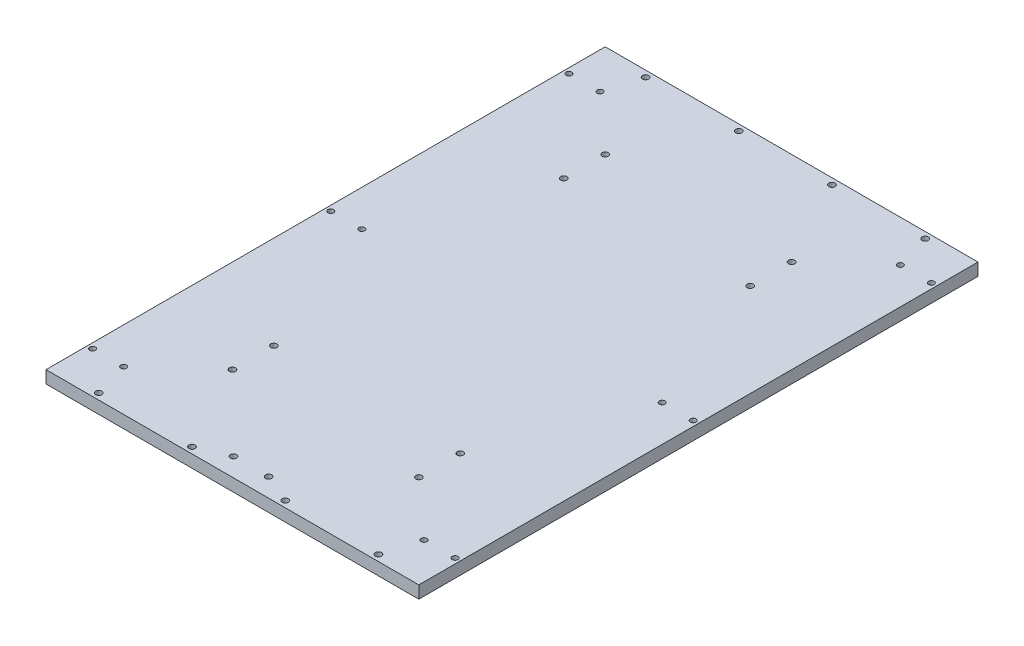
ISO-10303-21;
HEADER;
FILE_DESCRIPTION(('STEP AP214'),'2;1');
FILE_NAME('part.step','',(''),(''),'','','');
FILE_SCHEMA(('AUTOMOTIVE_DESIGN { 1 0 10303 214 1 1 1 1 }'));
ENDSEC;
DATA;
#1=APPLICATION_CONTEXT('core data for automotive mechanical design processes');
#2=APPLICATION_PROTOCOL_DEFINITION('international standard','automotive_design',2000,#1);
#3=PRODUCT_CONTEXT('',#1,'mechanical');
#4=PRODUCT('Part','Part','',(#3));
#5=PRODUCT_RELATED_PRODUCT_CATEGORY('part','',(#4));
#6=PRODUCT_DEFINITION_FORMATION('','',#4);
#7=PRODUCT_DEFINITION_CONTEXT('part definition',#1,'design');
#8=PRODUCT_DEFINITION('design','',#6,#7);
#9=PRODUCT_DEFINITION_SHAPE('','',#8);
#10=(LENGTH_UNIT() NAMED_UNIT(*) SI_UNIT(.MILLI.,.METRE.));
#11=(NAMED_UNIT(*) PLANE_ANGLE_UNIT() SI_UNIT($,.RADIAN.));
#12=(NAMED_UNIT(*) SI_UNIT($,.STERADIAN.) SOLID_ANGLE_UNIT());
#13=UNCERTAINTY_MEASURE_WITH_UNIT(LENGTH_MEASURE(1.E-05),#10,'distance_accuracy_value','');
#14=(GEOMETRIC_REPRESENTATION_CONTEXT(3) GLOBAL_UNCERTAINTY_ASSIGNED_CONTEXT((#13)) GLOBAL_UNIT_ASSIGNED_CONTEXT((#10,
#11,#12)) REPRESENTATION_CONTEXT('',''));
#15=CARTESIAN_POINT('',(0.,0.,0.));
#16=DIRECTION('',(0.,0.,1.));
#17=DIRECTION('',(1.,0.,0.));
#18=AXIS2_PLACEMENT_3D('',#15,#16,#17);
#19=CARTESIAN_POINT('',(180.,12.,-270.));
#20=DIRECTION('',(0.,-1.,0.));
#21=DIRECTION('',(0.,0.,-1.));
#22=AXIS2_PLACEMENT_3D('',#19,#20,#21);
#23=PLANE('',#22);
#24=CARTESIAN_POINT('',(90.,12.,-180.));
#25=DIRECTION('',(0.,-1.,0.));
#26=DIRECTION('',(0.,0.,1.));
#27=AXIS2_PLACEMENT_3D('',#24,#25,#26);
#28=CIRCLE('',#27,3.00000000000001);
#29=CARTESIAN_POINT('',(90.,12.,-177.));
#30=VERTEX_POINT('',#29);
#31=EDGE_CURVE('E168',#30,#30,#28,.T.);
#32=ORIENTED_EDGE('',*,*,#31,.T.);
#33=EDGE_LOOP('',(#32));
#34=FACE_BOUND('',#33,.T.);
#35=CARTESIAN_POINT('',(90.,12.,140.));
#36=DIRECTION('',(0.,1.,0.));
#37=DIRECTION('',(0.,0.,-1.));
#38=AXIS2_PLACEMENT_3D('',#35,#36,#37);
#39=CIRCLE('',#38,3.00000000000001);
#40=CARTESIAN_POINT('',(90.,12.,137.));
#41=VERTEX_POINT('',#40);
#42=EDGE_CURVE('E177',#41,#41,#39,.T.);
#43=ORIENTED_EDGE('',*,*,#42,.F.);
#44=EDGE_LOOP('',(#43));
#45=FACE_BOUND('',#44,.T.);
#46=CARTESIAN_POINT('',(90.,12.,180.));
#47=DIRECTION('',(0.,1.,0.));
#48=DIRECTION('',(0.,0.,-1.));
#49=AXIS2_PLACEMENT_3D('',#46,#47,#48);
#50=CIRCLE('',#49,3.00000000000001);
#51=CARTESIAN_POINT('',(90.,12.,177.));
#52=VERTEX_POINT('',#51);
#53=EDGE_CURVE('E183',#52,#52,#50,.T.);
#54=ORIENTED_EDGE('',*,*,#53,.F.);
#55=EDGE_LOOP('',(#54));
#56=FACE_BOUND('',#55,.T.);
#57=CARTESIAN_POINT('',(-90.,12.,180.));
#58=DIRECTION('',(0.,-1.,0.));
#59=DIRECTION('',(0.,0.,-1.));
#60=AXIS2_PLACEMENT_3D('',#57,#58,#59);
#61=CIRCLE('',#60,3.00000000000001);
#62=CARTESIAN_POINT('',(-90.,12.,177.));
#63=VERTEX_POINT('',#62);
#64=EDGE_CURVE('E192',#63,#63,#61,.T.);
#65=ORIENTED_EDGE('',*,*,#64,.T.);
#66=EDGE_LOOP('',(#65));
#67=FACE_BOUND('',#66,.T.);
#68=CARTESIAN_POINT('',(-90.,12.,-140.));
#69=DIRECTION('',(0.,1.,0.));
#70=DIRECTION('',(0.,0.,1.));
#71=AXIS2_PLACEMENT_3D('',#68,#69,#70);
#72=CIRCLE('',#71,3.00000000000001);
#73=CARTESIAN_POINT('',(-90.,12.,-137.));
#74=VERTEX_POINT('',#73);
#75=EDGE_CURVE('E199',#74,#74,#72,.T.);
#76=ORIENTED_EDGE('',*,*,#75,.F.);
#77=EDGE_LOOP('',(#76));
#78=FACE_BOUND('',#77,.T.);
#79=CARTESIAN_POINT('',(-90.,12.,-180.));
#80=DIRECTION('',(0.,1.,0.));
#81=DIRECTION('',(0.,0.,1.));
#82=AXIS2_PLACEMENT_3D('',#79,#80,#81);
#83=CIRCLE('',#82,3.00000000000001);
#84=CARTESIAN_POINT('',(-90.,12.,-177.));
#85=VERTEX_POINT('',#84);
#86=EDGE_CURVE('E205',#85,#85,#83,.T.);
#87=ORIENTED_EDGE('',*,*,#86,.F.);
#88=EDGE_LOOP('',(#87));
#89=FACE_BOUND('',#88,.T.);
#90=CARTESIAN_POINT('',(175.,12.,230.));
#91=DIRECTION('',(0.,-1.,0.));
#92=DIRECTION('',(0.,0.,1.));
#93=AXIS2_PLACEMENT_3D('',#90,#91,#92);
#94=CIRCLE('',#93,2.75000000000001);
#95=CARTESIAN_POINT('',(175.,12.,232.75));
#96=VERTEX_POINT('',#95);
#97=EDGE_CURVE('E214',#96,#96,#94,.T.);
#98=ORIENTED_EDGE('',*,*,#97,.T.);
#99=EDGE_LOOP('',(#98));
#100=FACE_BOUND('',#99,.T.);
#101=CARTESIAN_POINT('',(175.,12.,0.));
#102=DIRECTION('',(0.,-1.,0.));
#103=DIRECTION('',(0.,0.,1.));
#104=AXIS2_PLACEMENT_3D('',#101,#102,#103);
#105=CIRCLE('',#104,2.75000000000001);
#106=CARTESIAN_POINT('',(175.,12.,2.75000000000001));
#107=VERTEX_POINT('',#106);
#108=EDGE_CURVE('E224',#107,#107,#105,.T.);
#109=ORIENTED_EDGE('',*,*,#108,.T.);
#110=EDGE_LOOP('',(#109));
#111=FACE_BOUND('',#110,.T.);
#112=CARTESIAN_POINT('',(175.,12.,-230.));
#113=DIRECTION('',(0.,-1.,0.));
#114=DIRECTION('',(0.,0.,1.));
#115=AXIS2_PLACEMENT_3D('',#112,#113,#114);
#116=CIRCLE('',#115,2.75000000000001);
#117=CARTESIAN_POINT('',(175.,12.,-227.25));
#118=VERTEX_POINT('',#117);
#119=EDGE_CURVE('E234',#118,#118,#116,.T.);
#120=ORIENTED_EDGE('',*,*,#119,.T.);
#121=EDGE_LOOP('',(#120));
#122=FACE_BOUND('',#121,.T.);
#123=CARTESIAN_POINT('',(-175.,12.,0.));
#124=DIRECTION('',(0.,1.,0.));
#125=DIRECTION('',(0.,0.,1.));
#126=AXIS2_PLACEMENT_3D('',#123,#124,#125);
#127=CIRCLE('',#126,2.75000000000001);
#128=CARTESIAN_POINT('',(-175.,12.,2.75000000000001));
#129=VERTEX_POINT('',#128);
#130=EDGE_CURVE('E243',#129,#129,#127,.T.);
#131=ORIENTED_EDGE('',*,*,#130,.F.);
#132=EDGE_LOOP('',(#131));
#133=FACE_BOUND('',#132,.T.);
#134=CARTESIAN_POINT('',(-145.,12.,0.));
#135=DIRECTION('',(0.,1.,0.));
#136=DIRECTION('',(0.,0.,1.));
#137=AXIS2_PLACEMENT_3D('',#134,#135,#136);
#138=CIRCLE('',#137,2.75000000000001);
#139=CARTESIAN_POINT('',(-145.,12.,2.75000000000001));
#140=VERTEX_POINT('',#139);
#141=EDGE_CURVE('E249',#140,#140,#138,.T.);
#142=ORIENTED_EDGE('',*,*,#141,.F.);
#143=EDGE_LOOP('',(#142));
#144=FACE_BOUND('',#143,.T.);
#145=CARTESIAN_POINT('',(-145.,12.,-230.));
#146=DIRECTION('',(0.,1.,0.));
#147=DIRECTION('',(0.,0.,1.));
#148=AXIS2_PLACEMENT_3D('',#145,#146,#147);
#149=CIRCLE('',#148,2.75000000000001);
#150=CARTESIAN_POINT('',(-145.,12.,-227.25));
#151=VERTEX_POINT('',#150);
#152=EDGE_CURVE('E253',#151,#151,#149,.T.);
#153=ORIENTED_EDGE('',*,*,#152,.F.);
#154=EDGE_LOOP('',(#153));
#155=FACE_BOUND('',#154,.T.);
#156=CARTESIAN_POINT('',(-175.,12.,-230.));
#157=DIRECTION('',(0.,1.,0.));
#158=DIRECTION('',(0.,0.,1.));
#159=AXIS2_PLACEMENT_3D('',#156,#157,#158);
#160=CIRCLE('',#159,2.75000000000001);
#161=CARTESIAN_POINT('',(-175.,12.,-227.25));
#162=VERTEX_POINT('',#161);
#163=EDGE_CURVE('E259',#162,#162,#160,.T.);
#164=ORIENTED_EDGE('',*,*,#163,.F.);
#165=EDGE_LOOP('',(#164));
#166=FACE_BOUND('',#165,.T.);
#167=CARTESIAN_POINT('',(-45.,12.,-264.));
#168=DIRECTION('',(0.,-1.,0.));
#169=DIRECTION('',(0.,0.,-1.));
#170=AXIS2_PLACEMENT_3D('',#167,#168,#169);
#171=CIRCLE('',#170,2.99999999999999);
#172=CARTESIAN_POINT('',(-45.,12.,-267.));
#173=VERTEX_POINT('',#172);
#174=EDGE_CURVE('E268',#173,#173,#171,.T.);
#175=ORIENTED_EDGE('',*,*,#174,.T.);
#176=EDGE_LOOP('',(#175));
#177=FACE_BOUND('',#176,.T.);
#178=CARTESIAN_POINT('',(135.,12.,-264.));
#179=DIRECTION('',(0.,-1.,0.));
#180=DIRECTION('',(0.,0.,-1.));
#181=AXIS2_PLACEMENT_3D('',#178,#179,#180);
#182=CIRCLE('',#181,2.99999999999999);
#183=CARTESIAN_POINT('',(135.,12.,-267.));
#184=VERTEX_POINT('',#183);
#185=EDGE_CURVE('E280',#184,#184,#182,.T.);
#186=ORIENTED_EDGE('',*,*,#185,.T.);
#187=EDGE_LOOP('',(#186));
#188=FACE_BOUND('',#187,.T.);
#189=CARTESIAN_POINT('',(45.,12.,264.));
#190=DIRECTION('',(0.,-1.,0.));
#191=DIRECTION('',(0.,0.,-1.));
#192=AXIS2_PLACEMENT_3D('',#189,#190,#191);
#193=CIRCLE('',#192,2.99999999999999);
#194=CARTESIAN_POINT('',(45.,12.,261.));
#195=VERTEX_POINT('',#194);
#196=EDGE_CURVE('E291',#195,#195,#193,.F.);
#197=ORIENTED_EDGE('',*,*,#196,.F.);
#198=EDGE_LOOP('',(#197));
#199=FACE_BOUND('',#198,.T.);
#200=CARTESIAN_POINT('',(135.,12.,264.));
#201=DIRECTION('',(0.,-1.,0.));
#202=DIRECTION('',(0.,0.,-1.));
#203=AXIS2_PLACEMENT_3D('',#200,#201,#202);
#204=CIRCLE('',#203,2.99999999999999);
#205=CARTESIAN_POINT('',(135.,12.,261.));
#206=VERTEX_POINT('',#205);
#207=EDGE_CURVE('E297',#206,#206,#204,.F.);
#208=ORIENTED_EDGE('',*,*,#207,.F.);
#209=EDGE_LOOP('',(#208));
#210=FACE_BOUND('',#209,.T.);
#211=CARTESIAN_POINT('',(17.,12.,252.));
#212=DIRECTION('',(0.,-1.,0.));
#213=DIRECTION('',(0.,0.,-1.));
#214=AXIS2_PLACEMENT_3D('',#211,#212,#213);
#215=CIRCLE('',#214,3.00000000000001);
#216=CARTESIAN_POINT('',(17.,12.,249.));
#217=VERTEX_POINT('',#216);
#218=EDGE_CURVE('E303',#217,#217,#215,.F.);
#219=ORIENTED_EDGE('',*,*,#218,.F.);
#220=EDGE_LOOP('',(#219));
#221=FACE_BOUND('',#220,.T.);
#222=CARTESIAN_POINT('',(-17.,12.,252.));
#223=DIRECTION('',(0.,-1.,0.));
#224=DIRECTION('',(0.,0.,-1.));
#225=AXIS2_PLACEMENT_3D('',#222,#223,#224);
#226=CIRCLE('',#225,3.);
#227=CARTESIAN_POINT('',(-17.,12.,249.));
#228=VERTEX_POINT('',#227);
#229=EDGE_CURVE('E105',#228,#228,#226,.F.);
#230=ORIENTED_EDGE('',*,*,#229,.F.);
#231=EDGE_LOOP('',(#230));
#232=FACE_BOUND('',#231,.T.);
#233=DIRECTION('',(0.,0.,-1.));
#234=VECTOR('',#233,1.);
#235=CARTESIAN_POINT('',(180.,12.,270.));
#236=LINE('',#235,#234);
#237=CARTESIAN_POINT('',(180.,12.,270.));
#238=VERTEX_POINT('',#237);
#239=CARTESIAN_POINT('',(180.,12.,-270.));
#240=VERTEX_POINT('',#239);
#241=EDGE_CURVE('E87',#238,#240,#236,.T.);
#242=ORIENTED_EDGE('',*,*,#241,.T.);
#243=DIRECTION('',(-1.,0.,0.));
#244=VECTOR('',#243,1.);
#245=CARTESIAN_POINT('',(-180.,12.,-270.));
#246=LINE('',#245,#244);
#247=CARTESIAN_POINT('',(-180.,12.,-270.));
#248=VERTEX_POINT('',#247);
#249=EDGE_CURVE('E82',#240,#248,#246,.T.);
#250=ORIENTED_EDGE('',*,*,#249,.T.);
#251=DIRECTION('',(0.,0.,1.));
#252=VECTOR('',#251,1.);
#253=CARTESIAN_POINT('',(-180.,12.,270.));
#254=LINE('',#253,#252);
#255=CARTESIAN_POINT('',(-180.,12.,270.));
#256=VERTEX_POINT('',#255);
#257=EDGE_CURVE('E85',#248,#256,#254,.T.);
#258=ORIENTED_EDGE('',*,*,#257,.T.);
#259=DIRECTION('',(1.,0.,0.));
#260=VECTOR('',#259,1.);
#261=CARTESIAN_POINT('',(-180.,12.,270.));
#262=LINE('',#261,#260);
#263=EDGE_CURVE('E51',#256,#238,#262,.T.);
#264=ORIENTED_EDGE('',*,*,#263,.T.);
#265=EDGE_LOOP('',(#242,#250,#258,#264));
#266=FACE_BOUND('',#265,.T.);
#267=CARTESIAN_POINT('',(-45.,12.,264.));
#268=DIRECTION('',(0.,-1.,0.));
#269=DIRECTION('',(0.,0.,-1.));
#270=AXIS2_PLACEMENT_3D('',#267,#268,#269);
#271=CIRCLE('',#270,2.99999999999999);
#272=CARTESIAN_POINT('',(-45.,12.,261.));
#273=VERTEX_POINT('',#272);
#274=EDGE_CURVE('E115',#273,#273,#271,.F.);
#275=ORIENTED_EDGE('',*,*,#274,.F.);
#276=EDGE_LOOP('',(#275));
#277=FACE_BOUND('',#276,.T.);
#278=CARTESIAN_POINT('',(-135.,12.,264.));
#279=DIRECTION('',(0.,-1.,0.));
#280=DIRECTION('',(0.,0.,-1.));
#281=AXIS2_PLACEMENT_3D('',#278,#279,#280);
#282=CIRCLE('',#281,2.99999999999999);
#283=CARTESIAN_POINT('',(-135.,12.,261.));
#284=VERTEX_POINT('',#283);
#285=EDGE_CURVE('E121',#284,#284,#282,.F.);
#286=ORIENTED_EDGE('',*,*,#285,.F.);
#287=EDGE_LOOP('',(#286));
#288=FACE_BOUND('',#287,.T.);
#289=CARTESIAN_POINT('',(45.,12.,-264.));
#290=DIRECTION('',(0.,-1.,0.));
#291=DIRECTION('',(0.,0.,-1.));
#292=AXIS2_PLACEMENT_3D('',#289,#290,#291);
#293=CIRCLE('',#292,2.99999999999999);
#294=CARTESIAN_POINT('',(45.,12.,-267.));
#295=VERTEX_POINT('',#294);
#296=EDGE_CURVE('E274',#295,#295,#293,.T.);
#297=ORIENTED_EDGE('',*,*,#296,.T.);
#298=EDGE_LOOP('',(#297));
#299=FACE_BOUND('',#298,.T.);
#300=CARTESIAN_POINT('',(-135.,12.,-264.));
#301=DIRECTION('',(0.,-1.,0.));
#302=DIRECTION('',(0.,0.,-1.));
#303=AXIS2_PLACEMENT_3D('',#300,#301,#302);
#304=CIRCLE('',#303,2.99999999999999);
#305=CARTESIAN_POINT('',(-135.,12.,-267.));
#306=VERTEX_POINT('',#305);
#307=EDGE_CURVE('E262',#306,#306,#304,.T.);
#308=ORIENTED_EDGE('',*,*,#307,.T.);
#309=EDGE_LOOP('',(#308));
#310=FACE_BOUND('',#309,.T.);
#311=CARTESIAN_POINT('',(-145.,12.,230.));
#312=DIRECTION('',(0.,1.,0.));
#313=DIRECTION('',(0.,0.,1.));
#314=AXIS2_PLACEMENT_3D('',#311,#312,#313);
#315=CIRCLE('',#314,2.75000000000001);
#316=CARTESIAN_POINT('',(-145.,12.,232.75));
#317=VERTEX_POINT('',#316);
#318=EDGE_CURVE('E127',#317,#317,#315,.T.);
#319=ORIENTED_EDGE('',*,*,#318,.F.);
#320=EDGE_LOOP('',(#319));
#321=FACE_BOUND('',#320,.T.);
#322=CARTESIAN_POINT('',(-175.,12.,230.));
#323=DIRECTION('',(0.,1.,0.));
#324=DIRECTION('',(0.,0.,1.));
#325=AXIS2_PLACEMENT_3D('',#322,#323,#324);
#326=CIRCLE('',#325,2.75000000000001);
#327=CARTESIAN_POINT('',(-175.,12.,232.75));
#328=VERTEX_POINT('',#327);
#329=EDGE_CURVE('E11',#328,#328,#326,.T.);
#330=ORIENTED_EDGE('',*,*,#329,.F.);
#331=EDGE_LOOP('',(#330));
#332=FACE_BOUND('',#331,.T.);
#333=CARTESIAN_POINT('',(145.,12.,-230.));
#334=DIRECTION('',(0.,-1.,0.));
#335=DIRECTION('',(0.,0.,1.));
#336=AXIS2_PLACEMENT_3D('',#333,#334,#335);
#337=CIRCLE('',#336,2.75000000000001);
#338=CARTESIAN_POINT('',(145.,12.,-227.25));
#339=VERTEX_POINT('',#338);
#340=EDGE_CURVE('E148',#339,#339,#337,.T.);
#341=ORIENTED_EDGE('',*,*,#340,.T.);
#342=EDGE_LOOP('',(#341));
#343=FACE_BOUND('',#342,.T.);
#344=CARTESIAN_POINT('',(145.,12.,0.));
#345=DIRECTION('',(0.,-1.,0.));
#346=DIRECTION('',(0.,0.,1.));
#347=AXIS2_PLACEMENT_3D('',#344,#345,#346);
#348=CIRCLE('',#347,2.75000000000001);
#349=CARTESIAN_POINT('',(145.,12.,2.75000000000001));
#350=VERTEX_POINT('',#349);
#351=EDGE_CURVE('E152',#350,#350,#348,.T.);
#352=ORIENTED_EDGE('',*,*,#351,.T.);
#353=EDGE_LOOP('',(#352));
#354=FACE_BOUND('',#353,.T.);
#355=CARTESIAN_POINT('',(145.,12.,230.));
#356=DIRECTION('',(0.,-1.,0.));
#357=DIRECTION('',(0.,0.,1.));
#358=AXIS2_PLACEMENT_3D('',#355,#356,#357);
#359=CIRCLE('',#358,2.75000000000001);
#360=CARTESIAN_POINT('',(145.,12.,232.75));
#361=VERTEX_POINT('',#360);
#362=EDGE_CURVE('E156',#361,#361,#359,.T.);
#363=ORIENTED_EDGE('',*,*,#362,.T.);
#364=EDGE_LOOP('',(#363));
#365=FACE_BOUND('',#364,.T.);
#366=CARTESIAN_POINT('',(-90.,12.,140.));
#367=DIRECTION('',(0.,-1.,0.));
#368=DIRECTION('',(0.,0.,-1.));
#369=AXIS2_PLACEMENT_3D('',#366,#367,#368);
#370=CIRCLE('',#369,3.00000000000001);
#371=CARTESIAN_POINT('',(-90.,12.,137.));
#372=VERTEX_POINT('',#371);
#373=EDGE_CURVE('E160',#372,#372,#370,.T.);
#374=ORIENTED_EDGE('',*,*,#373,.T.);
#375=EDGE_LOOP('',(#374));
#376=FACE_BOUND('',#375,.T.);
#377=CARTESIAN_POINT('',(90.,12.,-140.));
#378=DIRECTION('',(0.,-1.,0.));
#379=DIRECTION('',(0.,0.,1.));
#380=AXIS2_PLACEMENT_3D('',#377,#378,#379);
#381=CIRCLE('',#380,3.00000000000001);
#382=CARTESIAN_POINT('',(90.,12.,-137.));
#383=VERTEX_POINT('',#382);
#384=EDGE_CURVE('E163',#383,#383,#381,.T.);
#385=ORIENTED_EDGE('',*,*,#384,.T.);
#386=EDGE_LOOP('',(#385));
#387=FACE_BOUND('',#386,.T.);
#388=ADVANCED_FACE('F34',(#34,#45,#56,#67,#78,#89,#100,#111,#122,#133,#144,#155,#166,#177,#188,
#199,#210,#221,#232,#266,#277,#288,#299,#310,#321,#332,#343,#354,#365,#376,#387),#23,.F.);
#389=CARTESIAN_POINT('',(180.,0.,-270.));
#390=DIRECTION('',(0.,-1.,0.));
#391=DIRECTION('',(0.,0.,-1.));
#392=AXIS2_PLACEMENT_3D('',#389,#390,#391);
#393=PLANE('',#392);
#394=CARTESIAN_POINT('',(90.,0.,-180.));
#395=DIRECTION('',(0.,-1.,0.));
#396=DIRECTION('',(0.,0.,-1.));
#397=AXIS2_PLACEMENT_3D('',#394,#395,#396);
#398=CIRCLE('',#397,3.00000000000001);
#399=CARTESIAN_POINT('',(90.,0.,-183.));
#400=VERTEX_POINT('',#399);
#401=EDGE_CURVE('E173',#400,#400,#398,.T.);
#402=ORIENTED_EDGE('',*,*,#401,.F.);
#403=EDGE_LOOP('',(#402));
#404=FACE_BOUND('',#403,.T.);
#405=CARTESIAN_POINT('',(90.,0.,140.));
#406=DIRECTION('',(0.,-1.,0.));
#407=DIRECTION('',(0.,0.,-1.));
#408=AXIS2_PLACEMENT_3D('',#405,#406,#407);
#409=CIRCLE('',#408,3.00000000000001);
#410=CARTESIAN_POINT('',(90.,0.,137.));
#411=VERTEX_POINT('',#410);
#412=EDGE_CURVE('E176',#411,#411,#409,.F.);
#413=ORIENTED_EDGE('',*,*,#412,.T.);
#414=EDGE_LOOP('',(#413));
#415=FACE_BOUND('',#414,.T.);
#416=CARTESIAN_POINT('',(90.,0.,180.));
#417=DIRECTION('',(0.,-1.,0.));
#418=DIRECTION('',(0.,0.,-1.));
#419=AXIS2_PLACEMENT_3D('',#416,#417,#418);
#420=CIRCLE('',#419,3.00000000000001);
#421=CARTESIAN_POINT('',(90.,0.,177.));
#422=VERTEX_POINT('',#421);
#423=EDGE_CURVE('E180',#422,#422,#420,.F.);
#424=ORIENTED_EDGE('',*,*,#423,.T.);
#425=EDGE_LOOP('',(#424));
#426=FACE_BOUND('',#425,.T.);
#427=CARTESIAN_POINT('',(-90.,0.,180.));
#428=DIRECTION('',(0.,-1.,0.));
#429=DIRECTION('',(0.,0.,-1.));
#430=AXIS2_PLACEMENT_3D('',#427,#428,#429);
#431=CIRCLE('',#430,3.00000000000001);
#432=CARTESIAN_POINT('',(-90.,0.,177.));
#433=VERTEX_POINT('',#432);
#434=EDGE_CURVE('E195',#433,#433,#431,.T.);
#435=ORIENTED_EDGE('',*,*,#434,.F.);
#436=EDGE_LOOP('',(#435));
#437=FACE_BOUND('',#436,.T.);
#438=CARTESIAN_POINT('',(-90.,0.,-140.));
#439=DIRECTION('',(0.,-1.,0.));
#440=DIRECTION('',(0.,0.,-1.));
#441=AXIS2_PLACEMENT_3D('',#438,#439,#440);
#442=CIRCLE('',#441,3.00000000000001);
#443=CARTESIAN_POINT('',(-90.,0.,-143.));
#444=VERTEX_POINT('',#443);
#445=EDGE_CURVE('E198',#444,#444,#442,.F.);
#446=ORIENTED_EDGE('',*,*,#445,.T.);
#447=EDGE_LOOP('',(#446));
#448=FACE_BOUND('',#447,.T.);
#449=CARTESIAN_POINT('',(-90.,0.,-180.));
#450=DIRECTION('',(0.,-1.,0.));
#451=DIRECTION('',(0.,0.,-1.));
#452=AXIS2_PLACEMENT_3D('',#449,#450,#451);
#453=CIRCLE('',#452,3.00000000000001);
#454=CARTESIAN_POINT('',(-90.,0.,-183.));
#455=VERTEX_POINT('',#454);
#456=EDGE_CURVE('E202',#455,#455,#453,.F.);
#457=ORIENTED_EDGE('',*,*,#456,.T.);
#458=EDGE_LOOP('',(#457));
#459=FACE_BOUND('',#458,.T.);
#460=CARTESIAN_POINT('',(175.,0.,230.));
#461=DIRECTION('',(0.,-1.,0.));
#462=DIRECTION('',(0.,0.,-1.));
#463=AXIS2_PLACEMENT_3D('',#460,#461,#462);
#464=CIRCLE('',#463,2.75000000000001);
#465=CARTESIAN_POINT('',(175.,0.,227.25));
#466=VERTEX_POINT('',#465);
#467=EDGE_CURVE('E217',#466,#466,#464,.T.);
#468=ORIENTED_EDGE('',*,*,#467,.F.);
#469=EDGE_LOOP('',(#468));
#470=FACE_BOUND('',#469,.T.);
#471=CARTESIAN_POINT('',(175.,0.,0.));
#472=DIRECTION('',(0.,-1.,0.));
#473=DIRECTION('',(0.,0.,-1.));
#474=AXIS2_PLACEMENT_3D('',#471,#472,#473);
#475=CIRCLE('',#474,2.75000000000001);
#476=CARTESIAN_POINT('',(175.,0.,-2.75000000000001));
#477=VERTEX_POINT('',#476);
#478=EDGE_CURVE('E227',#477,#477,#475,.T.);
#479=ORIENTED_EDGE('',*,*,#478,.F.);
#480=EDGE_LOOP('',(#479));
#481=FACE_BOUND('',#480,.T.);
#482=CARTESIAN_POINT('',(175.,0.,-230.));
#483=DIRECTION('',(0.,-1.,0.));
#484=DIRECTION('',(0.,0.,-1.));
#485=AXIS2_PLACEMENT_3D('',#482,#483,#484);
#486=CIRCLE('',#485,2.75000000000001);
#487=CARTESIAN_POINT('',(175.,0.,-232.75));
#488=VERTEX_POINT('',#487);
#489=EDGE_CURVE('E237',#488,#488,#486,.T.);
#490=ORIENTED_EDGE('',*,*,#489,.F.);
#491=EDGE_LOOP('',(#490));
#492=FACE_BOUND('',#491,.T.);
#493=CARTESIAN_POINT('',(-175.,0.,0.));
#494=DIRECTION('',(0.,-1.,0.));
#495=DIRECTION('',(0.,0.,-1.));
#496=AXIS2_PLACEMENT_3D('',#493,#494,#495);
#497=CIRCLE('',#496,2.75000000000001);
#498=CARTESIAN_POINT('',(-175.,0.,-2.75000000000001));
#499=VERTEX_POINT('',#498);
#500=EDGE_CURVE('E240',#499,#499,#497,.F.);
#501=ORIENTED_EDGE('',*,*,#500,.T.);
#502=EDGE_LOOP('',(#501));
#503=FACE_BOUND('',#502,.T.);
#504=CARTESIAN_POINT('',(-145.,0.,0.));
#505=DIRECTION('',(0.,-1.,0.));
#506=DIRECTION('',(0.,0.,-1.));
#507=AXIS2_PLACEMENT_3D('',#504,#505,#506);
#508=CIRCLE('',#507,2.75000000000001);
#509=CARTESIAN_POINT('',(-145.,0.,-2.75000000000001));
#510=VERTEX_POINT('',#509);
#511=EDGE_CURVE('E246',#510,#510,#508,.F.);
#512=ORIENTED_EDGE('',*,*,#511,.T.);
#513=EDGE_LOOP('',(#512));
#514=FACE_BOUND('',#513,.T.);
#515=CARTESIAN_POINT('',(-145.,0.,-230.));
#516=DIRECTION('',(0.,-1.,0.));
#517=DIRECTION('',(0.,0.,-1.));
#518=AXIS2_PLACEMENT_3D('',#515,#516,#517);
#519=CIRCLE('',#518,2.75000000000001);
#520=CARTESIAN_POINT('',(-145.,0.,-232.75));
#521=VERTEX_POINT('',#520);
#522=EDGE_CURVE('E252',#521,#521,#519,.F.);
#523=ORIENTED_EDGE('',*,*,#522,.T.);
#524=EDGE_LOOP('',(#523));
#525=FACE_BOUND('',#524,.T.);
#526=CARTESIAN_POINT('',(-175.,0.,-230.));
#527=DIRECTION('',(0.,-1.,0.));
#528=DIRECTION('',(0.,0.,-1.));
#529=AXIS2_PLACEMENT_3D('',#526,#527,#528);
#530=CIRCLE('',#529,2.75000000000001);
#531=CARTESIAN_POINT('',(-175.,0.,-232.75));
#532=VERTEX_POINT('',#531);
#533=EDGE_CURVE('E256',#532,#532,#530,.F.);
#534=ORIENTED_EDGE('',*,*,#533,.T.);
#535=EDGE_LOOP('',(#534));
#536=FACE_BOUND('',#535,.T.);
#537=CARTESIAN_POINT('',(-45.,0.,-264.));
#538=DIRECTION('',(0.,1.,0.));
#539=DIRECTION('',(0.,0.,1.));
#540=AXIS2_PLACEMENT_3D('',#537,#538,#539);
#541=CIRCLE('',#540,2.99999999999999);
#542=CARTESIAN_POINT('',(-45.,0.,-261.));
#543=VERTEX_POINT('',#542);
#544=EDGE_CURVE('E271',#543,#543,#541,.T.);
#545=ORIENTED_EDGE('',*,*,#544,.T.);
#546=EDGE_LOOP('',(#545));
#547=FACE_BOUND('',#546,.T.);
#548=CARTESIAN_POINT('',(135.,0.,-264.));
#549=DIRECTION('',(0.,1.,0.));
#550=DIRECTION('',(0.,0.,1.));
#551=AXIS2_PLACEMENT_3D('',#548,#549,#550);
#552=CIRCLE('',#551,2.99999999999999);
#553=CARTESIAN_POINT('',(135.,0.,-261.));
#554=VERTEX_POINT('',#553);
#555=EDGE_CURVE('E283',#554,#554,#552,.T.);
#556=ORIENTED_EDGE('',*,*,#555,.T.);
#557=EDGE_LOOP('',(#556));
#558=FACE_BOUND('',#557,.T.);
#559=CARTESIAN_POINT('',(45.,0.,264.));
#560=DIRECTION('',(0.,-1.,0.));
#561=DIRECTION('',(0.,0.,-1.));
#562=AXIS2_PLACEMENT_3D('',#559,#560,#561);
#563=CIRCLE('',#562,2.99999999999999);
#564=CARTESIAN_POINT('',(45.,0.,261.));
#565=VERTEX_POINT('',#564);
#566=EDGE_CURVE('E286',#565,#565,#563,.T.);
#567=ORIENTED_EDGE('',*,*,#566,.F.);
#568=EDGE_LOOP('',(#567));
#569=FACE_BOUND('',#568,.T.);
#570=CARTESIAN_POINT('',(135.,0.,264.));
#571=DIRECTION('',(0.,-1.,0.));
#572=DIRECTION('',(0.,0.,-1.));
#573=AXIS2_PLACEMENT_3D('',#570,#571,#572);
#574=CIRCLE('',#573,2.99999999999999);
#575=CARTESIAN_POINT('',(135.,0.,261.));
#576=VERTEX_POINT('',#575);
#577=EDGE_CURVE('E294',#576,#576,#574,.T.);
#578=ORIENTED_EDGE('',*,*,#577,.F.);
#579=EDGE_LOOP('',(#578));
#580=FACE_BOUND('',#579,.T.);
#581=CARTESIAN_POINT('',(17.,0.,252.));
#582=DIRECTION('',(0.,-1.,0.));
#583=DIRECTION('',(0.,0.,-1.));
#584=AXIS2_PLACEMENT_3D('',#581,#582,#583);
#585=CIRCLE('',#584,3.00000000000001);
#586=CARTESIAN_POINT('',(17.,0.,249.));
#587=VERTEX_POINT('',#586);
#588=EDGE_CURVE('E300',#587,#587,#585,.T.);
#589=ORIENTED_EDGE('',*,*,#588,.F.);
#590=EDGE_LOOP('',(#589));
#591=FACE_BOUND('',#590,.T.);
#592=CARTESIAN_POINT('',(-17.,0.,252.));
#593=DIRECTION('',(0.,-1.,0.));
#594=DIRECTION('',(0.,0.,-1.));
#595=AXIS2_PLACEMENT_3D('',#592,#593,#594);
#596=CIRCLE('',#595,3.);
#597=CARTESIAN_POINT('',(-17.,0.,249.));
#598=VERTEX_POINT('',#597);
#599=EDGE_CURVE('E306',#598,#598,#596,.T.);
#600=ORIENTED_EDGE('',*,*,#599,.F.);
#601=EDGE_LOOP('',(#600));
#602=FACE_BOUND('',#601,.T.);
#603=DIRECTION('',(0.,0.,-1.));
#604=VECTOR('',#603,1.);
#605=CARTESIAN_POINT('',(180.,0.,270.));
#606=LINE('',#605,#604);
#607=CARTESIAN_POINT('',(180.,0.,270.));
#608=VERTEX_POINT('',#607);
#609=CARTESIAN_POINT('',(180.,0.,-270.));
#610=VERTEX_POINT('',#609);
#611=EDGE_CURVE('E102',#608,#610,#606,.T.);
#612=ORIENTED_EDGE('',*,*,#611,.F.);
#613=DIRECTION('',(1.,0.,0.));
#614=VECTOR('',#613,1.);
#615=CARTESIAN_POINT('',(-180.,0.,270.));
#616=LINE('',#615,#614);
#617=CARTESIAN_POINT('',(-180.,0.,270.));
#618=VERTEX_POINT('',#617);
#619=EDGE_CURVE('E74',#618,#608,#616,.T.);
#620=ORIENTED_EDGE('',*,*,#619,.F.);
#621=DIRECTION('',(0.,0.,1.));
#622=VECTOR('',#621,1.);
#623=CARTESIAN_POINT('',(-180.,0.,270.));
#624=LINE('',#623,#622);
#625=CARTESIAN_POINT('',(-180.,0.,-270.));
#626=VERTEX_POINT('',#625);
#627=EDGE_CURVE('E68',#626,#618,#624,.T.);
#628=ORIENTED_EDGE('',*,*,#627,.F.);
#629=DIRECTION('',(-1.,0.,0.));
#630=VECTOR('',#629,1.);
#631=CARTESIAN_POINT('',(-180.,0.,-270.));
#632=LINE('',#631,#630);
#633=EDGE_CURVE('E92',#610,#626,#632,.T.);
#634=ORIENTED_EDGE('',*,*,#633,.F.);
#635=EDGE_LOOP('',(#612,#620,#628,#634));
#636=FACE_BOUND('',#635,.T.);
#637=CARTESIAN_POINT('',(-45.,0.,264.));
#638=DIRECTION('',(0.,-1.,0.));
#639=DIRECTION('',(0.,0.,-1.));
#640=AXIS2_PLACEMENT_3D('',#637,#638,#639);
#641=CIRCLE('',#640,2.99999999999999);
#642=CARTESIAN_POINT('',(-45.,0.,261.));
#643=VERTEX_POINT('',#642);
#644=EDGE_CURVE('E112',#643,#643,#641,.T.);
#645=ORIENTED_EDGE('',*,*,#644,.F.);
#646=EDGE_LOOP('',(#645));
#647=FACE_BOUND('',#646,.T.);
#648=CARTESIAN_POINT('',(-135.,0.,264.));
#649=DIRECTION('',(0.,-1.,0.));
#650=DIRECTION('',(0.,0.,-1.));
#651=AXIS2_PLACEMENT_3D('',#648,#649,#650);
#652=CIRCLE('',#651,2.99999999999999);
#653=CARTESIAN_POINT('',(-135.,0.,261.));
#654=VERTEX_POINT('',#653);
#655=EDGE_CURVE('E118',#654,#654,#652,.T.);
#656=ORIENTED_EDGE('',*,*,#655,.F.);
#657=EDGE_LOOP('',(#656));
#658=FACE_BOUND('',#657,.T.);
#659=CARTESIAN_POINT('',(45.,0.,-264.));
#660=DIRECTION('',(0.,1.,0.));
#661=DIRECTION('',(0.,0.,1.));
#662=AXIS2_PLACEMENT_3D('',#659,#660,#661);
#663=CIRCLE('',#662,2.99999999999999);
#664=CARTESIAN_POINT('',(45.,0.,-261.));
#665=VERTEX_POINT('',#664);
#666=EDGE_CURVE('E277',#665,#665,#663,.T.);
#667=ORIENTED_EDGE('',*,*,#666,.T.);
#668=EDGE_LOOP('',(#667));
#669=FACE_BOUND('',#668,.T.);
#670=CARTESIAN_POINT('',(-135.,0.,-264.));
#671=DIRECTION('',(0.,1.,0.));
#672=DIRECTION('',(0.,0.,1.));
#673=AXIS2_PLACEMENT_3D('',#670,#671,#672);
#674=CIRCLE('',#673,2.99999999999999);
#675=CARTESIAN_POINT('',(-135.,0.,-261.));
#676=VERTEX_POINT('',#675);
#677=EDGE_CURVE('E265',#676,#676,#674,.T.);
#678=ORIENTED_EDGE('',*,*,#677,.T.);
#679=EDGE_LOOP('',(#678));
#680=FACE_BOUND('',#679,.T.);
#681=CARTESIAN_POINT('',(-145.,0.,230.));
#682=DIRECTION('',(0.,-1.,0.));
#683=DIRECTION('',(0.,0.,-1.));
#684=AXIS2_PLACEMENT_3D('',#681,#682,#683);
#685=CIRCLE('',#684,2.75000000000001);
#686=CARTESIAN_POINT('',(-145.,0.,227.25));
#687=VERTEX_POINT('',#686);
#688=EDGE_CURVE('E124',#687,#687,#685,.F.);
#689=ORIENTED_EDGE('',*,*,#688,.T.);
#690=EDGE_LOOP('',(#689));
#691=FACE_BOUND('',#690,.T.);
#692=CARTESIAN_POINT('',(-175.,0.,230.));
#693=DIRECTION('',(0.,-1.,0.));
#694=DIRECTION('',(0.,0.,-1.));
#695=AXIS2_PLACEMENT_3D('',#692,#693,#694);
#696=CIRCLE('',#695,2.75000000000001);
#697=CARTESIAN_POINT('',(-175.,0.,227.25));
#698=VERTEX_POINT('',#697);
#699=EDGE_CURVE('E43',#698,#698,#696,.F.);
#700=ORIENTED_EDGE('',*,*,#699,.T.);
#701=EDGE_LOOP('',(#700));
#702=FACE_BOUND('',#701,.T.);
#703=CARTESIAN_POINT('',(145.,0.,-230.));
#704=DIRECTION('',(0.,-1.,0.));
#705=DIRECTION('',(0.,0.,-1.));
#706=AXIS2_PLACEMENT_3D('',#703,#704,#705);
#707=CIRCLE('',#706,2.75000000000001);
#708=CARTESIAN_POINT('',(145.,0.,-232.75));
#709=VERTEX_POINT('',#708);
#710=EDGE_CURVE('E231',#709,#709,#707,.T.);
#711=ORIENTED_EDGE('',*,*,#710,.F.);
#712=EDGE_LOOP('',(#711));
#713=FACE_BOUND('',#712,.T.);
#714=CARTESIAN_POINT('',(145.,0.,0.));
#715=DIRECTION('',(0.,-1.,0.));
#716=DIRECTION('',(0.,0.,-1.));
#717=AXIS2_PLACEMENT_3D('',#714,#715,#716);
#718=CIRCLE('',#717,2.75000000000001);
#719=CARTESIAN_POINT('',(145.,0.,-2.75000000000001));
#720=VERTEX_POINT('',#719);
#721=EDGE_CURVE('E221',#720,#720,#718,.T.);
#722=ORIENTED_EDGE('',*,*,#721,.F.);
#723=EDGE_LOOP('',(#722));
#724=FACE_BOUND('',#723,.T.);
#725=CARTESIAN_POINT('',(145.,0.,230.));
#726=DIRECTION('',(0.,-1.,0.));
#727=DIRECTION('',(0.,0.,-1.));
#728=AXIS2_PLACEMENT_3D('',#725,#726,#727);
#729=CIRCLE('',#728,2.75000000000001);
#730=CARTESIAN_POINT('',(145.,0.,227.25));
#731=VERTEX_POINT('',#730);
#732=EDGE_CURVE('E211',#731,#731,#729,.T.);
#733=ORIENTED_EDGE('',*,*,#732,.F.);
#734=EDGE_LOOP('',(#733));
#735=FACE_BOUND('',#734,.T.);
#736=CARTESIAN_POINT('',(-90.,0.,140.));
#737=DIRECTION('',(0.,-1.,0.));
#738=DIRECTION('',(0.,0.,-1.));
#739=AXIS2_PLACEMENT_3D('',#736,#737,#738);
#740=CIRCLE('',#739,3.00000000000001);
#741=CARTESIAN_POINT('',(-90.,0.,137.));
#742=VERTEX_POINT('',#741);
#743=EDGE_CURVE('E189',#742,#742,#740,.T.);
#744=ORIENTED_EDGE('',*,*,#743,.F.);
#745=EDGE_LOOP('',(#744));
#746=FACE_BOUND('',#745,.T.);
#747=CARTESIAN_POINT('',(90.,0.,-140.));
#748=DIRECTION('',(0.,-1.,0.));
#749=DIRECTION('',(0.,0.,-1.));
#750=AXIS2_PLACEMENT_3D('',#747,#748,#749);
#751=CIRCLE('',#750,3.00000000000001);
#752=CARTESIAN_POINT('',(90.,0.,-143.));
#753=VERTEX_POINT('',#752);
#754=EDGE_CURVE('E165',#753,#753,#751,.T.);
#755=ORIENTED_EDGE('',*,*,#754,.F.);
#756=EDGE_LOOP('',(#755));
#757=FACE_BOUND('',#756,.T.);
#758=ADVANCED_FACE('F132',(#404,#415,#426,#437,#448,#459,#470,#481,#492,#503,#514,#525,#536,
#547,#558,#569,#580,#591,#602,#636,#647,#658,#669,#680,#691,#702,#713,#724,#735,#746,#757),#393,.T.);
#759=CARTESIAN_POINT('',(180.,12.,270.));
#760=DIRECTION('',(-1.,0.,0.));
#761=DIRECTION('',(0.,0.,1.));
#762=AXIS2_PLACEMENT_3D('',#759,#760,#761);
#763=PLANE('',#762);
#764=ORIENTED_EDGE('',*,*,#611,.T.);
#765=DIRECTION('',(0.,-1.,0.));
#766=VECTOR('',#765,1.);
#767=CARTESIAN_POINT('',(180.,12.,-270.));
#768=LINE('',#767,#766);
#769=EDGE_CURVE('E93',#240,#610,#768,.T.);
#770=ORIENTED_EDGE('',*,*,#769,.F.);
#771=ORIENTED_EDGE('',*,*,#241,.F.);
#772=DIRECTION('',(0.,-1.,0.));
#773=VECTOR('',#772,1.);
#774=CARTESIAN_POINT('',(180.,12.,270.));
#775=LINE('',#774,#773);
#776=EDGE_CURVE('E98',#238,#608,#775,.T.);
#777=ORIENTED_EDGE('',*,*,#776,.T.);
#778=EDGE_LOOP('',(#764,#770,#771,#777));
#779=FACE_BOUND('',#778,.T.);
#780=ADVANCED_FACE('F330',(#779),#763,.F.);
#781=CARTESIAN_POINT('',(-180.,12.,-270.));
#782=DIRECTION('',(0.,0.,1.));
#783=DIRECTION('',(1.,0.,0.));
#784=AXIS2_PLACEMENT_3D('',#781,#782,#783);
#785=PLANE('',#784);
#786=ORIENTED_EDGE('',*,*,#633,.T.);
#787=DIRECTION('',(0.,-1.,0.));
#788=VECTOR('',#787,1.);
#789=CARTESIAN_POINT('',(-180.,12.,-270.));
#790=LINE('',#789,#788);
#791=EDGE_CURVE('E90',#248,#626,#790,.T.);
#792=ORIENTED_EDGE('',*,*,#791,.F.);
#793=ORIENTED_EDGE('',*,*,#249,.F.);
#794=ORIENTED_EDGE('',*,*,#769,.T.);
#795=EDGE_LOOP('',(#786,#792,#793,#794));
#796=FACE_BOUND('',#795,.T.);
#797=ADVANCED_FACE('F91',(#796),#785,.F.);
#798=CARTESIAN_POINT('',(-180.,12.,270.));
#799=DIRECTION('',(1.,0.,0.));
#800=DIRECTION('',(0.,0.,-1.));
#801=AXIS2_PLACEMENT_3D('',#798,#799,#800);
#802=PLANE('',#801);
#803=ORIENTED_EDGE('',*,*,#627,.T.);
#804=DIRECTION('',(0.,-1.,0.));
#805=VECTOR('',#804,1.);
#806=CARTESIAN_POINT('',(-180.,12.,270.));
#807=LINE('',#806,#805);
#808=EDGE_CURVE('E94',#256,#618,#807,.T.);
#809=ORIENTED_EDGE('',*,*,#808,.F.);
#810=ORIENTED_EDGE('',*,*,#257,.F.);
#811=ORIENTED_EDGE('',*,*,#791,.T.);
#812=EDGE_LOOP('',(#803,#809,#810,#811));
#813=FACE_BOUND('',#812,.T.);
#814=ADVANCED_FACE('F96',(#813),#802,.F.);
#815=CARTESIAN_POINT('',(-180.,12.,270.));
#816=DIRECTION('',(0.,0.,-1.));
#817=DIRECTION('',(-1.,0.,0.));
#818=AXIS2_PLACEMENT_3D('',#815,#816,#817);
#819=PLANE('',#818);
#820=ORIENTED_EDGE('',*,*,#619,.T.);
#821=ORIENTED_EDGE('',*,*,#776,.F.);
#822=ORIENTED_EDGE('',*,*,#263,.F.);
#823=ORIENTED_EDGE('',*,*,#808,.T.);
#824=EDGE_LOOP('',(#820,#821,#822,#823));
#825=FACE_BOUND('',#824,.T.);
#826=ADVANCED_FACE('F316',(#825),#819,.F.);
#827=CARTESIAN_POINT('',(-17.,12.001,252.));
#828=DIRECTION('',(0.,-1.,0.));
#829=DIRECTION('',(0.,0.,-1.));
#830=AXIS2_PLACEMENT_3D('',#827,#828,#829);
#831=CYLINDRICAL_SURFACE('',#830,3.);
#832=ORIENTED_EDGE('',*,*,#599,.T.);
#833=EDGE_LOOP('',(#832));
#834=FACE_BOUND('',#833,.T.);
#835=ORIENTED_EDGE('',*,*,#229,.T.);
#836=EDGE_LOOP('',(#835));
#837=FACE_BOUND('',#836,.T.);
#838=ADVANCED_FACE('F312',(#834,#837),#831,.F.);
#839=CARTESIAN_POINT('',(17.,12.001,252.));
#840=DIRECTION('',(0.,-1.,0.));
#841=DIRECTION('',(0.,0.,-1.));
#842=AXIS2_PLACEMENT_3D('',#839,#840,#841);
#843=CYLINDRICAL_SURFACE('',#842,3.00000000000001);
#844=ORIENTED_EDGE('',*,*,#588,.T.);
#845=EDGE_LOOP('',(#844));
#846=FACE_BOUND('',#845,.T.);
#847=ORIENTED_EDGE('',*,*,#218,.T.);
#848=EDGE_LOOP('',(#847));
#849=FACE_BOUND('',#848,.T.);
#850=ADVANCED_FACE('F315',(#846,#849),#843,.F.);
#851=CARTESIAN_POINT('',(135.,12.001,264.));
#852=DIRECTION('',(0.,-1.,0.));
#853=DIRECTION('',(0.,0.,-1.));
#854=AXIS2_PLACEMENT_3D('',#851,#852,#853);
#855=CYLINDRICAL_SURFACE('',#854,2.99999999999999);
#856=ORIENTED_EDGE('',*,*,#577,.T.);
#857=EDGE_LOOP('',(#856));
#858=FACE_BOUND('',#857,.T.);
#859=ORIENTED_EDGE('',*,*,#207,.T.);
#860=EDGE_LOOP('',(#859));
#861=FACE_BOUND('',#860,.T.);
#862=ADVANCED_FACE('F323',(#858,#861),#855,.F.);
#863=CARTESIAN_POINT('',(45.,12.001,264.));
#864=DIRECTION('',(0.,-1.,0.));
#865=DIRECTION('',(0.,0.,-1.));
#866=AXIS2_PLACEMENT_3D('',#863,#864,#865);
#867=CYLINDRICAL_SURFACE('',#866,2.99999999999999);
#868=ORIENTED_EDGE('',*,*,#566,.T.);
#869=EDGE_LOOP('',(#868));
#870=FACE_BOUND('',#869,.T.);
#871=ORIENTED_EDGE('',*,*,#196,.T.);
#872=EDGE_LOOP('',(#871));
#873=FACE_BOUND('',#872,.T.);
#874=ADVANCED_FACE('F344',(#870,#873),#867,.F.);
#875=CARTESIAN_POINT('',(-45.,12.001,264.));
#876=DIRECTION('',(0.,-1.,0.));
#877=DIRECTION('',(0.,0.,-1.));
#878=AXIS2_PLACEMENT_3D('',#875,#876,#877);
#879=CYLINDRICAL_SURFACE('',#878,2.99999999999999);
#880=ORIENTED_EDGE('',*,*,#644,.T.);
#881=EDGE_LOOP('',(#880));
#882=FACE_BOUND('',#881,.T.);
#883=ORIENTED_EDGE('',*,*,#274,.T.);
#884=EDGE_LOOP('',(#883));
#885=FACE_BOUND('',#884,.T.);
#886=ADVANCED_FACE('F340',(#882,#885),#879,.F.);
#887=CARTESIAN_POINT('',(-135.,12.001,264.));
#888=DIRECTION('',(0.,-1.,0.));
#889=DIRECTION('',(0.,0.,-1.));
#890=AXIS2_PLACEMENT_3D('',#887,#888,#889);
#891=CYLINDRICAL_SURFACE('',#890,2.99999999999999);
#892=ORIENTED_EDGE('',*,*,#655,.T.);
#893=EDGE_LOOP('',(#892));
#894=FACE_BOUND('',#893,.T.);
#895=ORIENTED_EDGE('',*,*,#285,.T.);
#896=EDGE_LOOP('',(#895));
#897=FACE_BOUND('',#896,.T.);
#898=ADVANCED_FACE('F343',(#894,#897),#891,.F.);
#899=CARTESIAN_POINT('',(135.,12.001,-264.));
#900=DIRECTION('',(0.,-1.,0.));
#901=DIRECTION('',(0.,0.,-1.));
#902=AXIS2_PLACEMENT_3D('',#899,#900,#901);
#903=CYLINDRICAL_SURFACE('',#902,2.99999999999999);
#904=ORIENTED_EDGE('',*,*,#555,.F.);
#905=EDGE_LOOP('',(#904));
#906=FACE_BOUND('',#905,.T.);
#907=ORIENTED_EDGE('',*,*,#185,.F.);
#908=EDGE_LOOP('',(#907));
#909=FACE_BOUND('',#908,.T.);
#910=ADVANCED_FACE('F347',(#906,#909),#903,.F.);
#911=CARTESIAN_POINT('',(45.,12.001,-264.));
#912=DIRECTION('',(0.,-1.,0.));
#913=DIRECTION('',(0.,0.,-1.));
#914=AXIS2_PLACEMENT_3D('',#911,#912,#913);
#915=CYLINDRICAL_SURFACE('',#914,2.99999999999999);
#916=ORIENTED_EDGE('',*,*,#666,.F.);
#917=EDGE_LOOP('',(#916));
#918=FACE_BOUND('',#917,.T.);
#919=ORIENTED_EDGE('',*,*,#296,.F.);
#920=EDGE_LOOP('',(#919));
#921=FACE_BOUND('',#920,.T.);
#922=ADVANCED_FACE('F387',(#918,#921),#915,.F.);
#923=CARTESIAN_POINT('',(-45.,12.001,-264.));
#924=DIRECTION('',(0.,-1.,0.));
#925=DIRECTION('',(0.,0.,-1.));
#926=AXIS2_PLACEMENT_3D('',#923,#924,#925);
#927=CYLINDRICAL_SURFACE('',#926,2.99999999999999);
#928=ORIENTED_EDGE('',*,*,#544,.F.);
#929=EDGE_LOOP('',(#928));
#930=FACE_BOUND('',#929,.T.);
#931=ORIENTED_EDGE('',*,*,#174,.F.);
#932=EDGE_LOOP('',(#931));
#933=FACE_BOUND('',#932,.T.);
#934=ADVANCED_FACE('F383',(#930,#933),#927,.F.);
#935=CARTESIAN_POINT('',(-135.,12.001,-264.));
#936=DIRECTION('',(0.,-1.,0.));
#937=DIRECTION('',(0.,0.,-1.));
#938=AXIS2_PLACEMENT_3D('',#935,#936,#937);
#939=CYLINDRICAL_SURFACE('',#938,2.99999999999999);
#940=ORIENTED_EDGE('',*,*,#677,.F.);
#941=EDGE_LOOP('',(#940));
#942=FACE_BOUND('',#941,.T.);
#943=ORIENTED_EDGE('',*,*,#307,.F.);
#944=EDGE_LOOP('',(#943));
#945=FACE_BOUND('',#944,.T.);
#946=ADVANCED_FACE('F379',(#942,#945),#939,.F.);
#947=CARTESIAN_POINT('',(-175.,-0.000999999999999265,-230.));
#948=DIRECTION('',(0.,1.,0.));
#949=DIRECTION('',(0.,0.,1.));
#950=AXIS2_PLACEMENT_3D('',#947,#948,#949);
#951=CYLINDRICAL_SURFACE('',#950,2.75000000000001);
#952=ORIENTED_EDGE('',*,*,#533,.F.);
#953=EDGE_LOOP('',(#952));
#954=FACE_BOUND('',#953,.T.);
#955=ORIENTED_EDGE('',*,*,#163,.T.);
#956=EDGE_LOOP('',(#955));
#957=FACE_BOUND('',#956,.T.);
#958=ADVANCED_FACE('F370',(#954,#957),#951,.F.);
#959=CARTESIAN_POINT('',(-145.,-0.000999999999999265,-230.));
#960=DIRECTION('',(0.,1.,0.));
#961=DIRECTION('',(0.,0.,1.));
#962=AXIS2_PLACEMENT_3D('',#959,#960,#961);
#963=CYLINDRICAL_SURFACE('',#962,2.75000000000001);
#964=ORIENTED_EDGE('',*,*,#522,.F.);
#965=EDGE_LOOP('',(#964));
#966=FACE_BOUND('',#965,.T.);
#967=ORIENTED_EDGE('',*,*,#152,.T.);
#968=EDGE_LOOP('',(#967));
#969=FACE_BOUND('',#968,.T.);
#970=ADVANCED_FACE('F359',(#966,#969),#963,.F.);
#971=CARTESIAN_POINT('',(-145.,-0.000999999999999265,0.));
#972=DIRECTION('',(0.,1.,0.));
#973=DIRECTION('',(0.,0.,1.));
#974=AXIS2_PLACEMENT_3D('',#971,#972,#973);
#975=CYLINDRICAL_SURFACE('',#974,2.75000000000001);
#976=ORIENTED_EDGE('',*,*,#511,.F.);
#977=EDGE_LOOP('',(#976));
#978=FACE_BOUND('',#977,.T.);
#979=ORIENTED_EDGE('',*,*,#141,.T.);
#980=EDGE_LOOP('',(#979));
#981=FACE_BOUND('',#980,.T.);
#982=ADVANCED_FACE('F351',(#978,#981),#975,.F.);
#983=CARTESIAN_POINT('',(-145.,-0.000999999999999265,230.));
#984=DIRECTION('',(0.,1.,0.));
#985=DIRECTION('',(0.,0.,1.));
#986=AXIS2_PLACEMENT_3D('',#983,#984,#985);
#987=CYLINDRICAL_SURFACE('',#986,2.75000000000001);
#988=ORIENTED_EDGE('',*,*,#688,.F.);
#989=EDGE_LOOP('',(#988));
#990=FACE_BOUND('',#989,.T.);
#991=ORIENTED_EDGE('',*,*,#318,.T.);
#992=EDGE_LOOP('',(#991));
#993=FACE_BOUND('',#992,.T.);
#994=ADVANCED_FACE('F349',(#990,#993),#987,.F.);
#995=CARTESIAN_POINT('',(-175.,-0.000999999999999265,0.));
#996=DIRECTION('',(0.,1.,0.));
#997=DIRECTION('',(0.,0.,1.));
#998=AXIS2_PLACEMENT_3D('',#995,#996,#997);
#999=CYLINDRICAL_SURFACE('',#998,2.75000000000001);
#1000=ORIENTED_EDGE('',*,*,#500,.F.);
#1001=EDGE_LOOP('',(#1000));
#1002=FACE_BOUND('',#1001,.T.);
#1003=ORIENTED_EDGE('',*,*,#130,.T.);
#1004=EDGE_LOOP('',(#1003));
#1005=FACE_BOUND('',#1004,.T.);
#1006=ADVANCED_FACE('F138',(#1002,#1005),#999,.F.);
#1007=CARTESIAN_POINT('',(-175.,-0.000999999999999265,230.));
#1008=DIRECTION('',(0.,1.,0.));
#1009=DIRECTION('',(0.,0.,1.));
#1010=AXIS2_PLACEMENT_3D('',#1007,#1008,#1009);
#1011=CYLINDRICAL_SURFACE('',#1010,2.75000000000001);
#1012=ORIENTED_EDGE('',*,*,#699,.F.);
#1013=EDGE_LOOP('',(#1012));
#1014=FACE_BOUND('',#1013,.T.);
#1015=ORIENTED_EDGE('',*,*,#329,.T.);
#1016=EDGE_LOOP('',(#1015));
#1017=FACE_BOUND('',#1016,.T.);
#1018=ADVANCED_FACE('F36',(#1014,#1017),#1011,.F.);
#1019=CARTESIAN_POINT('',(175.,-0.000999999999999265,-230.));
#1020=DIRECTION('',(0.,1.,0.));
#1021=DIRECTION('',(0.,0.,1.));
#1022=AXIS2_PLACEMENT_3D('',#1019,#1020,#1021);
#1023=CYLINDRICAL_SURFACE('',#1022,2.75000000000001);
#1024=ORIENTED_EDGE('',*,*,#489,.T.);
#1025=EDGE_LOOP('',(#1024));
#1026=FACE_BOUND('',#1025,.T.);
#1027=ORIENTED_EDGE('',*,*,#119,.F.);
#1028=EDGE_LOOP('',(#1027));
#1029=FACE_BOUND('',#1028,.T.);
#1030=ADVANCED_FACE('F137',(#1026,#1029),#1023,.F.);
#1031=CARTESIAN_POINT('',(145.,-0.000999999999999265,-230.));
#1032=DIRECTION('',(0.,1.,0.));
#1033=DIRECTION('',(0.,0.,1.));
#1034=AXIS2_PLACEMENT_3D('',#1031,#1032,#1033);
#1035=CYLINDRICAL_SURFACE('',#1034,2.75000000000001);
#1036=ORIENTED_EDGE('',*,*,#710,.T.);
#1037=EDGE_LOOP('',(#1036));
#1038=FACE_BOUND('',#1037,.T.);
#1039=ORIENTED_EDGE('',*,*,#340,.F.);
#1040=EDGE_LOOP('',(#1039));
#1041=FACE_BOUND('',#1040,.T.);
#1042=ADVANCED_FACE('F501',(#1038,#1041),#1035,.F.);
#1043=CARTESIAN_POINT('',(175.,-0.000999999999999265,0.));
#1044=DIRECTION('',(0.,1.,0.));
#1045=DIRECTION('',(0.,0.,1.));
#1046=AXIS2_PLACEMENT_3D('',#1043,#1044,#1045);
#1047=CYLINDRICAL_SURFACE('',#1046,2.75000000000001);
#1048=ORIENTED_EDGE('',*,*,#478,.T.);
#1049=EDGE_LOOP('',(#1048));
#1050=FACE_BOUND('',#1049,.T.);
#1051=ORIENTED_EDGE('',*,*,#108,.F.);
#1052=EDGE_LOOP('',(#1051));
#1053=FACE_BOUND('',#1052,.T.);
#1054=ADVANCED_FACE('F510',(#1050,#1053),#1047,.F.);
#1055=CARTESIAN_POINT('',(145.,-0.000999999999999265,0.));
#1056=DIRECTION('',(0.,1.,0.));
#1057=DIRECTION('',(0.,0.,1.));
#1058=AXIS2_PLACEMENT_3D('',#1055,#1056,#1057);
#1059=CYLINDRICAL_SURFACE('',#1058,2.75000000000001);
#1060=ORIENTED_EDGE('',*,*,#721,.T.);
#1061=EDGE_LOOP('',(#1060));
#1062=FACE_BOUND('',#1061,.T.);
#1063=ORIENTED_EDGE('',*,*,#351,.F.);
#1064=EDGE_LOOP('',(#1063));
#1065=FACE_BOUND('',#1064,.T.);
#1066=ADVANCED_FACE('F520',(#1062,#1065),#1059,.F.);
#1067=CARTESIAN_POINT('',(175.,-0.000999999999999265,230.));
#1068=DIRECTION('',(0.,1.,0.));
#1069=DIRECTION('',(0.,0.,1.));
#1070=AXIS2_PLACEMENT_3D('',#1067,#1068,#1069);
#1071=CYLINDRICAL_SURFACE('',#1070,2.75000000000001);
#1072=ORIENTED_EDGE('',*,*,#467,.T.);
#1073=EDGE_LOOP('',(#1072));
#1074=FACE_BOUND('',#1073,.T.);
#1075=ORIENTED_EDGE('',*,*,#97,.F.);
#1076=EDGE_LOOP('',(#1075));
#1077=FACE_BOUND('',#1076,.T.);
#1078=ADVANCED_FACE('F530',(#1074,#1077),#1071,.F.);
#1079=CARTESIAN_POINT('',(145.,-0.000999999999999265,230.));
#1080=DIRECTION('',(0.,1.,0.));
#1081=DIRECTION('',(0.,0.,1.));
#1082=AXIS2_PLACEMENT_3D('',#1079,#1080,#1081);
#1083=CYLINDRICAL_SURFACE('',#1082,2.75000000000001);
#1084=ORIENTED_EDGE('',*,*,#732,.T.);
#1085=EDGE_LOOP('',(#1084));
#1086=FACE_BOUND('',#1085,.T.);
#1087=ORIENTED_EDGE('',*,*,#362,.F.);
#1088=EDGE_LOOP('',(#1087));
#1089=FACE_BOUND('',#1088,.T.);
#1090=ADVANCED_FACE('F540',(#1086,#1089),#1083,.F.);
#1091=CARTESIAN_POINT('',(-90.,-0.000999999999999265,-180.));
#1092=DIRECTION('',(0.,1.,0.));
#1093=DIRECTION('',(0.,0.,1.));
#1094=AXIS2_PLACEMENT_3D('',#1091,#1092,#1093);
#1095=CYLINDRICAL_SURFACE('',#1094,3.00000000000001);
#1096=ORIENTED_EDGE('',*,*,#456,.F.);
#1097=EDGE_LOOP('',(#1096));
#1098=FACE_BOUND('',#1097,.T.);
#1099=ORIENTED_EDGE('',*,*,#86,.T.);
#1100=EDGE_LOOP('',(#1099));
#1101=FACE_BOUND('',#1100,.T.);
#1102=ADVANCED_FACE('F550',(#1098,#1101),#1095,.F.);
#1103=CARTESIAN_POINT('',(-90.,-0.000999999999999265,-140.));
#1104=DIRECTION('',(0.,1.,0.));
#1105=DIRECTION('',(0.,0.,1.));
#1106=AXIS2_PLACEMENT_3D('',#1103,#1104,#1105);
#1107=CYLINDRICAL_SURFACE('',#1106,3.00000000000001);
#1108=ORIENTED_EDGE('',*,*,#445,.F.);
#1109=EDGE_LOOP('',(#1108));
#1110=FACE_BOUND('',#1109,.T.);
#1111=ORIENTED_EDGE('',*,*,#75,.T.);
#1112=EDGE_LOOP('',(#1111));
#1113=FACE_BOUND('',#1112,.T.);
#1114=ADVANCED_FACE('F560',(#1110,#1113),#1107,.F.);
#1115=CARTESIAN_POINT('',(-90.,-0.000999999999999265,180.));
#1116=DIRECTION('',(0.,1.,0.));
#1117=DIRECTION('',(0.,0.,1.));
#1118=AXIS2_PLACEMENT_3D('',#1115,#1116,#1117);
#1119=CYLINDRICAL_SURFACE('',#1118,3.00000000000001);
#1120=ORIENTED_EDGE('',*,*,#434,.T.);
#1121=EDGE_LOOP('',(#1120));
#1122=FACE_BOUND('',#1121,.T.);
#1123=ORIENTED_EDGE('',*,*,#64,.F.);
#1124=EDGE_LOOP('',(#1123));
#1125=FACE_BOUND('',#1124,.T.);
#1126=ADVANCED_FACE('F570',(#1122,#1125),#1119,.F.);
#1127=CARTESIAN_POINT('',(-90.,-0.000999999999999265,140.));
#1128=DIRECTION('',(0.,1.,0.));
#1129=DIRECTION('',(0.,0.,1.));
#1130=AXIS2_PLACEMENT_3D('',#1127,#1128,#1129);
#1131=CYLINDRICAL_SURFACE('',#1130,3.00000000000001);
#1132=ORIENTED_EDGE('',*,*,#743,.T.);
#1133=EDGE_LOOP('',(#1132));
#1134=FACE_BOUND('',#1133,.T.);
#1135=ORIENTED_EDGE('',*,*,#373,.F.);
#1136=EDGE_LOOP('',(#1135));
#1137=FACE_BOUND('',#1136,.T.);
#1138=ADVANCED_FACE('F580',(#1134,#1137),#1131,.F.);
#1139=CARTESIAN_POINT('',(90.,-0.000999999999999265,180.));
#1140=DIRECTION('',(0.,1.,0.));
#1141=DIRECTION('',(0.,0.,1.));
#1142=AXIS2_PLACEMENT_3D('',#1139,#1140,#1141);
#1143=CYLINDRICAL_SURFACE('',#1142,3.00000000000001);
#1144=ORIENTED_EDGE('',*,*,#423,.F.);
#1145=EDGE_LOOP('',(#1144));
#1146=FACE_BOUND('',#1145,.T.);
#1147=ORIENTED_EDGE('',*,*,#53,.T.);
#1148=EDGE_LOOP('',(#1147));
#1149=FACE_BOUND('',#1148,.T.);
#1150=ADVANCED_FACE('F590',(#1146,#1149),#1143,.F.);
#1151=CARTESIAN_POINT('',(90.,-0.000999999999999265,140.));
#1152=DIRECTION('',(0.,1.,0.));
#1153=DIRECTION('',(0.,0.,1.));
#1154=AXIS2_PLACEMENT_3D('',#1151,#1152,#1153);
#1155=CYLINDRICAL_SURFACE('',#1154,3.00000000000001);
#1156=ORIENTED_EDGE('',*,*,#412,.F.);
#1157=EDGE_LOOP('',(#1156));
#1158=FACE_BOUND('',#1157,.T.);
#1159=ORIENTED_EDGE('',*,*,#42,.T.);
#1160=EDGE_LOOP('',(#1159));
#1161=FACE_BOUND('',#1160,.T.);
#1162=ADVANCED_FACE('F612',(#1158,#1161),#1155,.F.);
#1163=CARTESIAN_POINT('',(90.,-0.000999999999999265,-180.));
#1164=DIRECTION('',(0.,1.,0.));
#1165=DIRECTION('',(0.,0.,1.));
#1166=AXIS2_PLACEMENT_3D('',#1163,#1164,#1165);
#1167=CYLINDRICAL_SURFACE('',#1166,3.00000000000001);
#1168=ORIENTED_EDGE('',*,*,#401,.T.);
#1169=EDGE_LOOP('',(#1168));
#1170=FACE_BOUND('',#1169,.T.);
#1171=ORIENTED_EDGE('',*,*,#31,.F.);
#1172=EDGE_LOOP('',(#1171));
#1173=FACE_BOUND('',#1172,.T.);
#1174=ADVANCED_FACE('F622',(#1170,#1173),#1167,.F.);
#1175=CARTESIAN_POINT('',(90.,-0.000999999999999265,-140.));
#1176=DIRECTION('',(0.,1.,0.));
#1177=DIRECTION('',(0.,0.,1.));
#1178=AXIS2_PLACEMENT_3D('',#1175,#1176,#1177);
#1179=CYLINDRICAL_SURFACE('',#1178,3.00000000000001);
#1180=ORIENTED_EDGE('',*,*,#754,.T.);
#1181=EDGE_LOOP('',(#1180));
#1182=FACE_BOUND('',#1181,.T.);
#1183=ORIENTED_EDGE('',*,*,#384,.F.);
#1184=EDGE_LOOP('',(#1183));
#1185=FACE_BOUND('',#1184,.T.);
#1186=ADVANCED_FACE('F632',(#1182,#1185),#1179,.F.);
#1187=CLOSED_SHELL('',(#388,#758,#780,#797,#814,#826,#838,#850,#862,#874,#886,#898,#910,#922,
#934,#946,#958,#970,#982,#994,#1006,#1018,#1030,#1042,#1054,#1066,#1078,#1090,#1102,#1114,#1126,
#1138,#1150,#1162,#1174,#1186));
#1188=MANIFOLD_SOLID_BREP('B2',#1187);
#1189=ADVANCED_BREP_SHAPE_REPRESENTATION('',(#18,#1188),#14);
#1190=SHAPE_DEFINITION_REPRESENTATION(#9,#1189);
ENDSEC;
END-ISO-10303-21;
